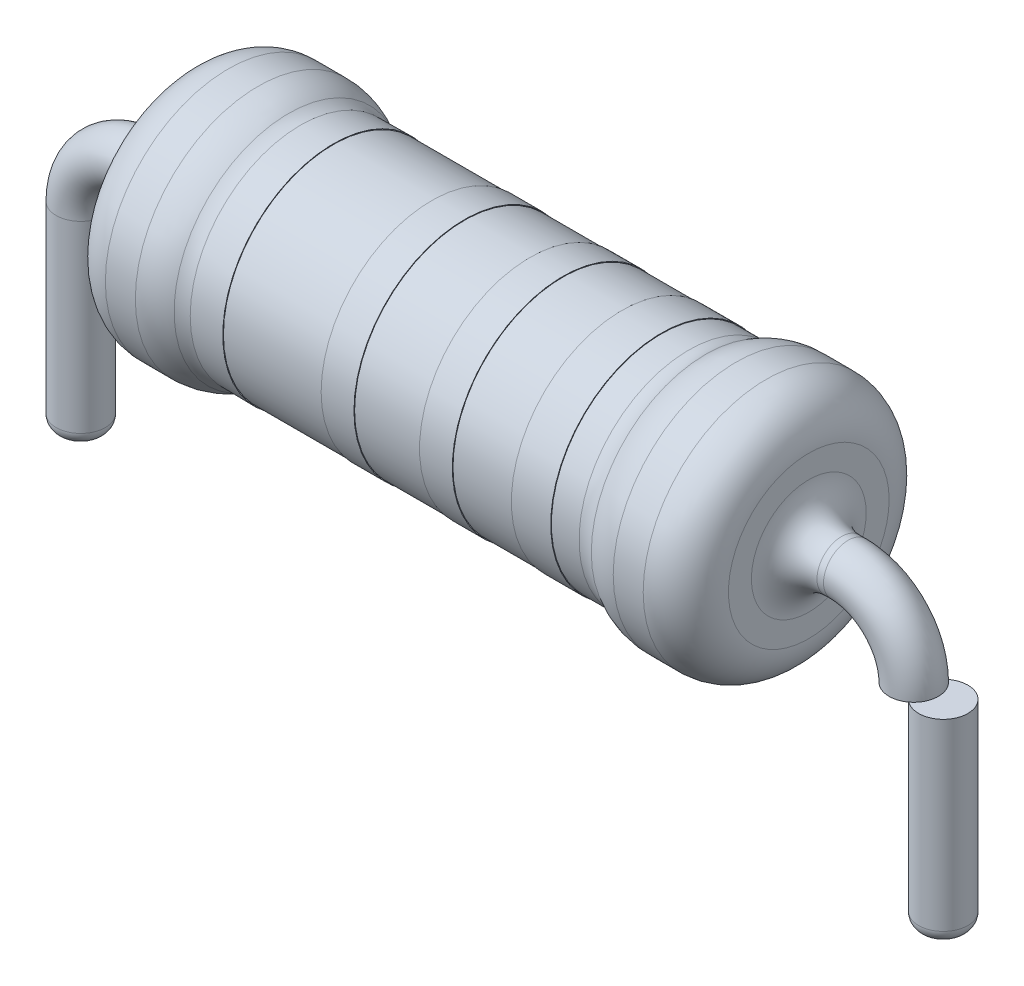
ISO-10303-21;
HEADER;
FILE_DESCRIPTION(('STEP AP214'),'2;1');
FILE_NAME('part.step','',(''),(''),'','','');
FILE_SCHEMA(('AUTOMOTIVE_DESIGN { 1 0 10303 214 1 1 1 1 }'));
ENDSEC;
DATA;
#1=APPLICATION_CONTEXT('core data for automotive mechanical design processes');
#2=APPLICATION_PROTOCOL_DEFINITION('international standard','automotive_design',2000,#1);
#3=PRODUCT_CONTEXT('',#1,'mechanical');
#4=PRODUCT('Part','Part','',(#3));
#5=PRODUCT_RELATED_PRODUCT_CATEGORY('part','',(#4));
#6=PRODUCT_DEFINITION_FORMATION('','',#4);
#7=PRODUCT_DEFINITION_CONTEXT('part definition',#1,'design');
#8=PRODUCT_DEFINITION('design','',#6,#7);
#9=PRODUCT_DEFINITION_SHAPE('','',#8);
#10=(LENGTH_UNIT() NAMED_UNIT(*) SI_UNIT(.MILLI.,.METRE.));
#11=(NAMED_UNIT(*) PLANE_ANGLE_UNIT() SI_UNIT($,.RADIAN.));
#12=(NAMED_UNIT(*) SI_UNIT($,.STERADIAN.) SOLID_ANGLE_UNIT());
#13=UNCERTAINTY_MEASURE_WITH_UNIT(LENGTH_MEASURE(1.E-05),#10,'distance_accuracy_value','');
#14=(GEOMETRIC_REPRESENTATION_CONTEXT(3) GLOBAL_UNCERTAINTY_ASSIGNED_CONTEXT((#13)) GLOBAL_UNIT_ASSIGNED_CONTEXT((#10,
#11,#12)) REPRESENTATION_CONTEXT('',''));
#15=CARTESIAN_POINT('',(0.,0.,0.));
#16=DIRECTION('',(0.,0.,1.));
#17=DIRECTION('',(1.,0.,0.));
#18=AXIS2_PLACEMENT_3D('',#15,#16,#17);
#19=CARTESIAN_POINT('',(2.5,7.5,0.));
#20=DIRECTION('',(1.,0.,0.));
#21=DIRECTION('',(0.,0.,-1.));
#22=AXIS2_PLACEMENT_3D('',#19,#20,#21);
#23=PLANE('',#22);
#24=CARTESIAN_POINT('',(2.5,7.5,0.));
#25=DIRECTION('',(1.,0.,0.));
#26=DIRECTION('',(0.,0.,-1.));
#27=AXIS2_PLACEMENT_3D('',#24,#25,#26);
#28=CIRCLE('',#27,1.675);
#29=CARTESIAN_POINT('',(2.5,7.5,-1.675));
#30=VERTEX_POINT('',#29);
#31=EDGE_CURVE('E135',#30,#30,#28,.T.);
#32=ORIENTED_EDGE('',*,*,#31,.F.);
#33=EDGE_LOOP('',(#32));
#34=FACE_BOUND('',#33,.T.);
#35=CARTESIAN_POINT('',(2.5,7.5,0.));
#36=DIRECTION('',(1.,0.,0.));
#37=DIRECTION('',(0.,0.,-1.));
#38=AXIS2_PLACEMENT_3D('',#35,#36,#37);
#39=CIRCLE('',#38,1.685);
#40=CARTESIAN_POINT('',(2.5,7.5,-1.685));
#41=VERTEX_POINT('',#40);
#42=EDGE_CURVE('E130',#41,#41,#39,.F.);
#43=ORIENTED_EDGE('',*,*,#42,.F.);
#44=EDGE_LOOP('',(#43));
#45=FACE_BOUND('',#44,.T.);
#46=ADVANCED_FACE('F47',(#34,#45),#23,.T.);
#47=CARTESIAN_POINT('',(1.9,7.5,0.));
#48=DIRECTION('',(1.,0.,0.));
#49=DIRECTION('',(0.,0.,-1.));
#50=AXIS2_PLACEMENT_3D('',#47,#48,#49);
#51=CYLINDRICAL_SURFACE('',#50,1.685);
#52=ORIENTED_EDGE('',*,*,#42,.T.);
#53=EDGE_LOOP('',(#52));
#54=FACE_BOUND('',#53,.T.);
#55=CARTESIAN_POINT('',(1.9,7.5,0.));
#56=DIRECTION('',(1.,0.,0.));
#57=DIRECTION('',(0.,0.,-1.));
#58=AXIS2_PLACEMENT_3D('',#55,#56,#57);
#59=CIRCLE('',#58,1.685);
#60=CARTESIAN_POINT('',(1.9,7.5,-1.685));
#61=VERTEX_POINT('',#60);
#62=EDGE_CURVE('E163',#61,#61,#59,.T.);
#63=ORIENTED_EDGE('',*,*,#62,.T.);
#64=EDGE_LOOP('',(#63));
#65=FACE_BOUND('',#64,.T.);
#66=ADVANCED_FACE('F230',(#54,#65),#51,.T.);
#67=CARTESIAN_POINT('',(1.9,7.5,0.));
#68=DIRECTION('',(1.,0.,0.));
#69=DIRECTION('',(0.,0.,-1.));
#70=AXIS2_PLACEMENT_3D('',#67,#68,#69);
#71=PLANE('',#70);
#72=ORIENTED_EDGE('',*,*,#62,.F.);
#73=EDGE_LOOP('',(#72));
#74=FACE_BOUND('',#73,.T.);
#75=CARTESIAN_POINT('',(1.9,7.5,0.));
#76=DIRECTION('',(-1.,0.,0.));
#77=DIRECTION('',(0.,0.,1.));
#78=AXIS2_PLACEMENT_3D('',#75,#76,#77);
#79=CIRCLE('',#78,1.675);
#80=CARTESIAN_POINT('',(1.9,7.5,1.675));
#81=VERTEX_POINT('',#80);
#82=EDGE_CURVE('E169',#81,#81,#79,.T.);
#83=ORIENTED_EDGE('',*,*,#82,.F.);
#84=EDGE_LOOP('',(#83));
#85=FACE_BOUND('',#84,.T.);
#86=ADVANCED_FACE('F226',(#74,#85),#71,.F.);
#87=CARTESIAN_POINT('',(-4.75,7.5,0.));
#88=DIRECTION('',(-1.,0.,0.));
#89=DIRECTION('',(0.,0.,1.));
#90=AXIS2_PLACEMENT_3D('',#87,#88,#89);
#91=CYLINDRICAL_SURFACE('',#90,1.675);
#92=ORIENTED_EDGE('',*,*,#82,.T.);
#93=EDGE_LOOP('',(#92));
#94=FACE_BOUND('',#93,.T.);
#95=CARTESIAN_POINT('',(1.,7.5,0.));
#96=DIRECTION('',(-1.,0.,0.));
#97=DIRECTION('',(0.,0.,1.));
#98=AXIS2_PLACEMENT_3D('',#95,#96,#97);
#99=CIRCLE('',#98,1.675);
#100=CARTESIAN_POINT('',(1.,7.5,1.675));
#101=VERTEX_POINT('',#100);
#102=EDGE_CURVE('E495',#101,#101,#99,.T.);
#103=ORIENTED_EDGE('',*,*,#102,.F.);
#104=EDGE_LOOP('',(#103));
#105=FACE_BOUND('',#104,.T.);
#106=ADVANCED_FACE('F222',(#94,#105),#91,.T.);
#107=CARTESIAN_POINT('',(1.,7.5,0.));
#108=DIRECTION('',(1.,0.,0.));
#109=DIRECTION('',(0.,0.,-1.));
#110=AXIS2_PLACEMENT_3D('',#107,#108,#109);
#111=PLANE('',#110);
#112=CARTESIAN_POINT('',(1.,7.5,0.));
#113=DIRECTION('',(1.,0.,0.));
#114=DIRECTION('',(0.,0.,-1.));
#115=AXIS2_PLACEMENT_3D('',#112,#113,#114);
#116=CIRCLE('',#115,1.685);
#117=CARTESIAN_POINT('',(1.,7.5,-1.685));
#118=VERTEX_POINT('',#117);
#119=EDGE_CURVE('E490',#118,#118,#116,.F.);
#120=ORIENTED_EDGE('',*,*,#119,.F.);
#121=EDGE_LOOP('',(#120));
#122=FACE_BOUND('',#121,.T.);
#123=ORIENTED_EDGE('',*,*,#102,.T.);
#124=EDGE_LOOP('',(#123));
#125=FACE_BOUND('',#124,.T.);
#126=ADVANCED_FACE('F218',(#122,#125),#111,.T.);
#127=CARTESIAN_POINT('',(0.5,7.5,0.));
#128=DIRECTION('',(1.,0.,0.));
#129=DIRECTION('',(0.,0.,-1.));
#130=AXIS2_PLACEMENT_3D('',#127,#128,#129);
#131=CYLINDRICAL_SURFACE('',#130,1.685);
#132=ORIENTED_EDGE('',*,*,#119,.T.);
#133=EDGE_LOOP('',(#132));
#134=FACE_BOUND('',#133,.T.);
#135=CARTESIAN_POINT('',(0.5,7.5,0.));
#136=DIRECTION('',(1.,0.,0.));
#137=DIRECTION('',(0.,0.,-1.));
#138=AXIS2_PLACEMENT_3D('',#135,#136,#137);
#139=CIRCLE('',#138,1.685);
#140=CARTESIAN_POINT('',(0.5,7.5,-1.685));
#141=VERTEX_POINT('',#140);
#142=EDGE_CURVE('E485',#141,#141,#139,.T.);
#143=ORIENTED_EDGE('',*,*,#142,.T.);
#144=EDGE_LOOP('',(#143));
#145=FACE_BOUND('',#144,.T.);
#146=ADVANCED_FACE('F214',(#134,#145),#131,.T.);
#147=CARTESIAN_POINT('',(0.5,7.5,0.));
#148=DIRECTION('',(1.,0.,0.));
#149=DIRECTION('',(0.,0.,-1.));
#150=AXIS2_PLACEMENT_3D('',#147,#148,#149);
#151=PLANE('',#150);
#152=ORIENTED_EDGE('',*,*,#142,.F.);
#153=EDGE_LOOP('',(#152));
#154=FACE_BOUND('',#153,.T.);
#155=CARTESIAN_POINT('',(0.5,7.5,0.));
#156=DIRECTION('',(-1.,0.,0.));
#157=DIRECTION('',(0.,0.,1.));
#158=AXIS2_PLACEMENT_3D('',#155,#156,#157);
#159=CIRCLE('',#158,1.675);
#160=CARTESIAN_POINT('',(0.5,7.5,1.675));
#161=VERTEX_POINT('',#160);
#162=EDGE_CURVE('E480',#161,#161,#159,.T.);
#163=ORIENTED_EDGE('',*,*,#162,.F.);
#164=EDGE_LOOP('',(#163));
#165=FACE_BOUND('',#164,.T.);
#166=ADVANCED_FACE('F210',(#154,#165),#151,.F.);
#167=CARTESIAN_POINT('',(-4.75,7.5,0.));
#168=DIRECTION('',(-1.,0.,0.));
#169=DIRECTION('',(0.,0.,1.));
#170=AXIS2_PLACEMENT_3D('',#167,#168,#169);
#171=CYLINDRICAL_SURFACE('',#170,1.675);
#172=ORIENTED_EDGE('',*,*,#162,.T.);
#173=EDGE_LOOP('',(#172));
#174=FACE_BOUND('',#173,.T.);
#175=CARTESIAN_POINT('',(-0.5,7.5,0.));
#176=DIRECTION('',(-1.,0.,0.));
#177=DIRECTION('',(0.,0.,1.));
#178=AXIS2_PLACEMENT_3D('',#175,#176,#177);
#179=CIRCLE('',#178,1.675);
#180=CARTESIAN_POINT('',(-0.5,7.5,1.675));
#181=VERTEX_POINT('',#180);
#182=EDGE_CURVE('E475',#181,#181,#179,.T.);
#183=ORIENTED_EDGE('',*,*,#182,.F.);
#184=EDGE_LOOP('',(#183));
#185=FACE_BOUND('',#184,.T.);
#186=ADVANCED_FACE('F206',(#174,#185),#171,.T.);
#187=CARTESIAN_POINT('',(-0.5,7.5,0.));
#188=DIRECTION('',(1.,0.,0.));
#189=DIRECTION('',(0.,0.,-1.));
#190=AXIS2_PLACEMENT_3D('',#187,#188,#189);
#191=PLANE('',#190);
#192=ORIENTED_EDGE('',*,*,#182,.T.);
#193=EDGE_LOOP('',(#192));
#194=FACE_BOUND('',#193,.T.);
#195=CARTESIAN_POINT('',(-0.5,7.5,0.));
#196=DIRECTION('',(-1.,0.,0.));
#197=DIRECTION('',(0.,0.,1.));
#198=AXIS2_PLACEMENT_3D('',#195,#196,#197);
#199=CIRCLE('',#198,1.685);
#200=CARTESIAN_POINT('',(-0.5,7.5,1.685));
#201=VERTEX_POINT('',#200);
#202=EDGE_CURVE('E471',#201,#201,#199,.T.);
#203=ORIENTED_EDGE('',*,*,#202,.F.);
#204=EDGE_LOOP('',(#203));
#205=FACE_BOUND('',#204,.T.);
#206=ADVANCED_FACE('F202',(#194,#205),#191,.T.);
#207=CARTESIAN_POINT('',(-0.5,7.5,0.));
#208=DIRECTION('',(-1.,0.,0.));
#209=DIRECTION('',(0.,0.,1.));
#210=AXIS2_PLACEMENT_3D('',#207,#208,#209);
#211=CYLINDRICAL_SURFACE('',#210,1.685);
#212=ORIENTED_EDGE('',*,*,#202,.T.);
#213=EDGE_LOOP('',(#212));
#214=FACE_BOUND('',#213,.T.);
#215=CARTESIAN_POINT('',(-1.,7.5,0.));
#216=DIRECTION('',(-1.,0.,0.));
#217=DIRECTION('',(0.,0.,1.));
#218=AXIS2_PLACEMENT_3D('',#215,#216,#217);
#219=CIRCLE('',#218,1.685);
#220=CARTESIAN_POINT('',(-1.,7.5,1.685));
#221=VERTEX_POINT('',#220);
#222=EDGE_CURVE('E467',#221,#221,#219,.F.);
#223=ORIENTED_EDGE('',*,*,#222,.T.);
#224=EDGE_LOOP('',(#223));
#225=FACE_BOUND('',#224,.T.);
#226=ADVANCED_FACE('F198',(#214,#225),#211,.T.);
#227=CARTESIAN_POINT('',(-3.,7.5,0.));
#228=DIRECTION('',(1.,0.,0.));
#229=DIRECTION('',(0.,0.,-1.));
#230=AXIS2_PLACEMENT_3D('',#227,#228,#229);
#231=CYLINDRICAL_SURFACE('',#230,1.685);
#232=CARTESIAN_POINT('',(-3.,7.5,0.));
#233=DIRECTION('',(-1.,0.,0.));
#234=DIRECTION('',(0.,0.,1.));
#235=AXIS2_PLACEMENT_3D('',#232,#233,#234);
#236=CIRCLE('',#235,1.68103627422793);
#237=CARTESIAN_POINT('',(-3.,7.5,1.68103627422793));
#238=VERTEX_POINT('',#237);
#239=EDGE_CURVE('E78',#238,#238,#236,.T.);
#240=ORIENTED_EDGE('',*,*,#239,.F.);
#241=EDGE_LOOP('',(#240));
#242=FACE_BOUND('',#241,.T.);
#243=CARTESIAN_POINT('',(-2.5,7.5,0.));
#244=DIRECTION('',(1.,0.,0.));
#245=DIRECTION('',(0.,0.,-1.));
#246=AXIS2_PLACEMENT_3D('',#243,#244,#245);
#247=CIRCLE('',#246,1.685);
#248=CARTESIAN_POINT('',(-2.5,7.5,-1.685));
#249=VERTEX_POINT('',#248);
#250=EDGE_CURVE('E141',#249,#249,#247,.T.);
#251=ORIENTED_EDGE('',*,*,#250,.F.);
#252=EDGE_LOOP('',(#251));
#253=FACE_BOUND('',#252,.T.);
#254=ADVANCED_FACE('F187',(#242,#253),#231,.T.);
#255=CARTESIAN_POINT('',(-1.,7.5,0.));
#256=DIRECTION('',(1.,0.,0.));
#257=DIRECTION('',(0.,0.,-1.));
#258=AXIS2_PLACEMENT_3D('',#255,#256,#257);
#259=PLANE('',#258);
#260=CARTESIAN_POINT('',(-1.,7.5,0.));
#261=DIRECTION('',(-1.,0.,0.));
#262=DIRECTION('',(0.,0.,1.));
#263=AXIS2_PLACEMENT_3D('',#260,#261,#262);
#264=CIRCLE('',#263,1.675);
#265=CARTESIAN_POINT('',(-1.,7.5,1.675));
#266=VERTEX_POINT('',#265);
#267=EDGE_CURVE('E136',#266,#266,#264,.T.);
#268=ORIENTED_EDGE('',*,*,#267,.F.);
#269=EDGE_LOOP('',(#268));
#270=FACE_BOUND('',#269,.T.);
#271=ORIENTED_EDGE('',*,*,#222,.F.);
#272=EDGE_LOOP('',(#271));
#273=FACE_BOUND('',#272,.T.);
#274=ADVANCED_FACE('F197',(#270,#273),#259,.F.);
#275=CARTESIAN_POINT('',(-2.5,7.5,0.));
#276=DIRECTION('',(1.,0.,0.));
#277=DIRECTION('',(0.,0.,-1.));
#278=AXIS2_PLACEMENT_3D('',#275,#276,#277);
#279=PLANE('',#278);
#280=ORIENTED_EDGE('',*,*,#250,.T.);
#281=EDGE_LOOP('',(#280));
#282=FACE_BOUND('',#281,.T.);
#283=CARTESIAN_POINT('',(-2.5,7.5,0.));
#284=DIRECTION('',(-1.,0.,0.));
#285=DIRECTION('',(0.,0.,1.));
#286=AXIS2_PLACEMENT_3D('',#283,#284,#285);
#287=CIRCLE('',#286,1.675);
#288=CARTESIAN_POINT('',(-2.5,7.5,1.675));
#289=VERTEX_POINT('',#288);
#290=EDGE_CURVE('E131',#289,#289,#287,.F.);
#291=ORIENTED_EDGE('',*,*,#290,.F.);
#292=EDGE_LOOP('',(#291));
#293=FACE_BOUND('',#292,.T.);
#294=ADVANCED_FACE('F270',(#282,#293),#279,.T.);
#295=CARTESIAN_POINT('',(-4.75,7.5,0.));
#296=DIRECTION('',(-1.,0.,0.));
#297=DIRECTION('',(0.,0.,1.));
#298=AXIS2_PLACEMENT_3D('',#295,#296,#297);
#299=CYLINDRICAL_SURFACE('',#298,1.675);
#300=ORIENTED_EDGE('',*,*,#290,.T.);
#301=EDGE_LOOP('',(#300));
#302=FACE_BOUND('',#301,.T.);
#303=ORIENTED_EDGE('',*,*,#267,.T.);
#304=EDGE_LOOP('',(#303));
#305=FACE_BOUND('',#304,.T.);
#306=ADVANCED_FACE('F268',(#302,#305),#299,.T.);
#307=CARTESIAN_POINT('',(-4.75,7.5,0.));
#308=DIRECTION('',(-1.,0.,0.));
#309=DIRECTION('',(0.,0.,1.));
#310=AXIS2_PLACEMENT_3D('',#307,#308,#309);
#311=CYLINDRICAL_SURFACE('',#310,1.675);
#312=CARTESIAN_POINT('',(2.92254138123248,7.5,0.));
#313=DIRECTION('',(1.,0.,0.));
#314=DIRECTION('',(0.,0.,-1.));
#315=AXIS2_PLACEMENT_3D('',#312,#313,#314);
#316=CIRCLE('',#315,1.675);
#317=CARTESIAN_POINT('',(2.92254138123248,7.5,-1.675));
#318=VERTEX_POINT('',#317);
#319=EDGE_CURVE('E707',#318,#318,#316,.F.);
#320=ORIENTED_EDGE('',*,*,#319,.T.);
#321=EDGE_LOOP('',(#320));
#322=FACE_BOUND('',#321,.T.);
#323=ORIENTED_EDGE('',*,*,#31,.T.);
#324=EDGE_LOOP('',(#323));
#325=FACE_BOUND('',#324,.T.);
#326=ADVANCED_FACE('F238',(#322,#325),#311,.T.);
#327=CARTESIAN_POINT('',(3.64302352755487,7.5,0.));
#328=DIRECTION('',(-1.,0.,0.));
#329=DIRECTION('',(0.,0.,1.));
#330=AXIS2_PLACEMENT_3D('',#327,#328,#329);
#331=TOROIDAL_SURFACE('',#330,0.977263692076684,0.897736307923315);
#332=CARTESIAN_POINT('',(3.18027316591827,7.5,0.));
#333=DIRECTION('',(1.,0.,0.));
#334=DIRECTION('',(0.,0.,-1.));
#335=AXIS2_PLACEMENT_3D('',#332,#333,#334);
#336=CIRCLE('',#335,1.74654425297041);
#337=CARTESIAN_POINT('',(3.18027316591827,7.5,-1.74654425297041));
#338=VERTEX_POINT('',#337);
#339=EDGE_CURVE('E698',#338,#338,#336,.T.);
#340=ORIENTED_EDGE('',*,*,#339,.T.);
#341=EDGE_LOOP('',(#340));
#342=FACE_BOUND('',#341,.T.);
#343=CARTESIAN_POINT('',(3.64302352755487,7.5,0.));
#344=DIRECTION('',(-1.,0.,0.));
#345=DIRECTION('',(0.,0.,1.));
#346=AXIS2_PLACEMENT_3D('',#343,#344,#345);
#347=CIRCLE('',#346,1.875);
#348=CARTESIAN_POINT('',(3.64302352755487,7.5,1.875));
#349=VERTEX_POINT('',#348);
#350=EDGE_CURVE('E126',#349,#349,#347,.F.);
#351=ORIENTED_EDGE('',*,*,#350,.F.);
#352=EDGE_LOOP('',(#351));
#353=FACE_BOUND('',#352,.T.);
#354=ADVANCED_FACE('F278',(#342,#353),#331,.T.);
#355=CARTESIAN_POINT('',(-4.75,7.5,0.));
#356=DIRECTION('',(-1.,0.,0.));
#357=DIRECTION('',(0.,0.,1.));
#358=AXIS2_PLACEMENT_3D('',#355,#356,#357);
#359=CYLINDRICAL_SURFACE('',#358,1.875);
#360=CARTESIAN_POINT('',(4.1,7.5,0.));
#361=DIRECTION('',(1.,0.,0.));
#362=DIRECTION('',(0.,0.,-1.));
#363=AXIS2_PLACEMENT_3D('',#360,#361,#362);
#364=CIRCLE('',#363,1.875);
#365=CARTESIAN_POINT('',(4.1,7.5,-1.875));
#366=VERTEX_POINT('',#365);
#367=EDGE_CURVE('E55',#366,#366,#364,.F.);
#368=ORIENTED_EDGE('',*,*,#367,.T.);
#369=EDGE_LOOP('',(#368));
#370=FACE_BOUND('',#369,.T.);
#371=ORIENTED_EDGE('',*,*,#350,.T.);
#372=EDGE_LOOP('',(#371));
#373=FACE_BOUND('',#372,.T.);
#374=ADVANCED_FACE('F286',(#370,#373),#359,.T.);
#375=CARTESIAN_POINT('',(4.75,0.,0.));
#376=DIRECTION('',(1.,0.,0.));
#377=DIRECTION('',(0.,0.,-1.));
#378=AXIS2_PLACEMENT_3D('',#375,#376,#377);
#379=PLANE('',#378);
#380=CARTESIAN_POINT('',(4.75,7.5,0.));
#381=DIRECTION('',(1.,0.,0.));
#382=DIRECTION('',(0.,0.,-1.));
#383=AXIS2_PLACEMENT_3D('',#380,#381,#382);
#384=CIRCLE('',#383,1.225);
#385=CARTESIAN_POINT('',(4.75,7.5,-1.225));
#386=VERTEX_POINT('',#385);
#387=EDGE_CURVE('E13',#386,#386,#384,.T.);
#388=ORIENTED_EDGE('',*,*,#387,.T.);
#389=EDGE_LOOP('',(#388));
#390=FACE_BOUND('',#389,.T.);
#391=CARTESIAN_POINT('',(4.75,7.5,0.));
#392=DIRECTION('',(1.,0.,0.));
#393=DIRECTION('',(0.,0.,-1.));
#394=AXIS2_PLACEMENT_3D('',#391,#392,#393);
#395=CIRCLE('',#394,0.875);
#396=CARTESIAN_POINT('',(4.75,7.5,-0.875));
#397=VERTEX_POINT('',#396);
#398=EDGE_CURVE('E695',#397,#397,#395,.F.);
#399=ORIENTED_EDGE('',*,*,#398,.T.);
#400=EDGE_LOOP('',(#399));
#401=FACE_BOUND('',#400,.T.);
#402=ADVANCED_FACE('F290',(#390,#401),#379,.T.);
#403=CARTESIAN_POINT('',(5.35,7.5,0.));
#404=DIRECTION('',(-1.,0.,0.));
#405=DIRECTION('',(0.,0.,1.));
#406=AXIS2_PLACEMENT_3D('',#403,#404,#405);
#407=CYLINDRICAL_SURFACE('',#406,0.375);
#408=CARTESIAN_POINT('',(5.25,7.5,0.));
#409=DIRECTION('',(1.,0.,0.));
#410=DIRECTION('',(0.,0.,-1.));
#411=AXIS2_PLACEMENT_3D('',#408,#409,#410);
#412=CIRCLE('',#411,0.375);
#413=CARTESIAN_POINT('',(5.25,7.5,-0.375));
#414=VERTEX_POINT('',#413);
#415=EDGE_CURVE('E701',#414,#414,#412,.T.);
#416=ORIENTED_EDGE('',*,*,#415,.T.);
#417=EDGE_LOOP('',(#416));
#418=FACE_BOUND('',#417,.T.);
#419=CARTESIAN_POINT('',(5.35,7.50000000000001,0.));
#420=DIRECTION('',(-1.,0.,0.));
#421=DIRECTION('',(0.,0.,1.));
#422=AXIS2_PLACEMENT_3D('',#419,#420,#421);
#423=CIRCLE('',#422,0.375);
#424=CARTESIAN_POINT('',(5.35,7.50000000000001,0.375));
#425=VERTEX_POINT('',#424);
#426=EDGE_CURVE('E74',#425,#425,#423,.F.);
#427=ORIENTED_EDGE('',*,*,#426,.F.);
#428=EDGE_LOOP('',(#427));
#429=FACE_BOUND('',#428,.T.);
#430=ADVANCED_FACE('F294',(#418,#429),#407,.T.);
#431=CARTESIAN_POINT('',(5.35,6.5,0.));
#432=DIRECTION('',(0.,0.,1.));
#433=DIRECTION('',(1.,0.,0.));
#434=AXIS2_PLACEMENT_3D('',#431,#432,#433);
#435=TOROIDAL_SURFACE('',#434,1.,0.375);
#436=CARTESIAN_POINT('',(6.35,6.5,0.));
#437=DIRECTION('',(0.,1.,0.));
#438=DIRECTION('',(0.,0.,1.));
#439=AXIS2_PLACEMENT_3D('',#436,#437,#438);
#440=CIRCLE('',#439,0.375);
#441=CARTESIAN_POINT('',(6.575,6.5,-0.299999999999999));
#442=VERTEX_POINT('',#441);
#443=CARTESIAN_POINT('',(6.575,6.5,0.300000000000002));
#444=VERTEX_POINT('',#443);
#445=EDGE_CURVE('E66',#442,#444,#440,.F.);
#446=ORIENTED_EDGE('',*,*,#445,.F.);
#447=EDGE_CURVE('E69',#444,#442,#440,.F.);
#448=ORIENTED_EDGE('',*,*,#447,.F.);
#449=EDGE_LOOP('',(#446,#448));
#450=FACE_BOUND('',#449,.T.);
#451=ORIENTED_EDGE('',*,*,#426,.T.);
#452=EDGE_LOOP('',(#451));
#453=FACE_BOUND('',#452,.T.);
#454=ADVANCED_FACE('F67',(#450,#453),#435,.T.);
#455=CARTESIAN_POINT('',(6.35,6.5,0.375));
#456=DIRECTION('',(0.,1.,0.));
#457=DIRECTION('',(0.,0.,1.));
#458=AXIS2_PLACEMENT_3D('',#455,#456,#457);
#459=PLANE('',#458);
#460=CARTESIAN_POINT('',(6.8,6.5,0.));
#461=DIRECTION('',(0.,-1.,0.));
#462=DIRECTION('',(0.,0.,-1.));
#463=AXIS2_PLACEMENT_3D('',#460,#461,#462);
#464=CIRCLE('',#463,0.375);
#465=EDGE_CURVE('E61',#444,#442,#464,.T.);
#466=ORIENTED_EDGE('',*,*,#465,.F.);
#467=ORIENTED_EDGE('',*,*,#447,.T.);
#468=EDGE_LOOP('',(#466,#467));
#469=FACE_BOUND('',#468,.T.);
#470=ADVANCED_FACE('F76',(#469),#459,.F.);
#471=CARTESIAN_POINT('',(-2.92254138123248,7.5,0.));
#472=DIRECTION('',(-1.,0.,0.));
#473=DIRECTION('',(0.,0.,1.));
#474=AXIS2_PLACEMENT_3D('',#471,#472,#473);
#475=TOROIDAL_SURFACE('',#474,2.175,0.5);
#476=ORIENTED_EDGE('',*,*,#239,.T.);
#477=EDGE_LOOP('',(#476));
#478=FACE_BOUND('',#477,.T.);
#479=CARTESIAN_POINT('',(-3.18027316591826,7.5,0.));
#480=DIRECTION('',(1.,0.,0.));
#481=DIRECTION('',(0.,0.,-1.));
#482=AXIS2_PLACEMENT_3D('',#479,#480,#481);
#483=CIRCLE('',#482,1.74654425297041);
#484=CARTESIAN_POINT('',(-3.18027316591826,7.5,-1.74654425297041));
#485=VERTEX_POINT('',#484);
#486=EDGE_CURVE('E97',#485,#485,#483,.F.);
#487=ORIENTED_EDGE('',*,*,#486,.F.);
#488=EDGE_LOOP('',(#487));
#489=FACE_BOUND('',#488,.T.);
#490=ADVANCED_FACE('F106',(#478,#489),#475,.F.);
#491=CARTESIAN_POINT('',(-3.64302352755487,7.5,0.));
#492=DIRECTION('',(-1.,0.,0.));
#493=DIRECTION('',(0.,0.,1.));
#494=AXIS2_PLACEMENT_3D('',#491,#492,#493);
#495=TOROIDAL_SURFACE('',#494,0.977263692076682,0.897736307923316);
#496=ORIENTED_EDGE('',*,*,#486,.T.);
#497=EDGE_LOOP('',(#496));
#498=FACE_BOUND('',#497,.T.);
#499=CARTESIAN_POINT('',(-3.64302352755487,7.5,0.));
#500=DIRECTION('',(1.,0.,0.));
#501=DIRECTION('',(0.,0.,-1.));
#502=AXIS2_PLACEMENT_3D('',#499,#500,#501);
#503=CIRCLE('',#502,1.875);
#504=CARTESIAN_POINT('',(-3.64302352755487,7.5,-1.875));
#505=VERTEX_POINT('',#504);
#506=EDGE_CURVE('E93',#505,#505,#503,.F.);
#507=ORIENTED_EDGE('',*,*,#506,.F.);
#508=EDGE_LOOP('',(#507));
#509=FACE_BOUND('',#508,.T.);
#510=ADVANCED_FACE('F111',(#498,#509),#495,.T.);
#511=CARTESIAN_POINT('',(-4.75,7.5,0.));
#512=DIRECTION('',(-1.,0.,0.));
#513=DIRECTION('',(0.,0.,1.));
#514=AXIS2_PLACEMENT_3D('',#511,#512,#513);
#515=CYLINDRICAL_SURFACE('',#514,1.875);
#516=CARTESIAN_POINT('',(-4.1,7.5,0.));
#517=DIRECTION('',(-1.,0.,0.));
#518=DIRECTION('',(0.,0.,1.));
#519=AXIS2_PLACEMENT_3D('',#516,#517,#518);
#520=CIRCLE('',#519,1.875);
#521=CARTESIAN_POINT('',(-4.1,7.5,1.875));
#522=VERTEX_POINT('',#521);
#523=EDGE_CURVE('E710',#522,#522,#520,.F.);
#524=ORIENTED_EDGE('',*,*,#523,.T.);
#525=EDGE_LOOP('',(#524));
#526=FACE_BOUND('',#525,.T.);
#527=ORIENTED_EDGE('',*,*,#506,.T.);
#528=EDGE_LOOP('',(#527));
#529=FACE_BOUND('',#528,.T.);
#530=ADVANCED_FACE('F316',(#526,#529),#515,.T.);
#531=CARTESIAN_POINT('',(-4.75,0.,0.));
#532=DIRECTION('',(-1.,0.,0.));
#533=DIRECTION('',(0.,0.,1.));
#534=AXIS2_PLACEMENT_3D('',#531,#532,#533);
#535=PLANE('',#534);
#536=CARTESIAN_POINT('',(-4.75,7.5,0.));
#537=DIRECTION('',(-1.,0.,0.));
#538=DIRECTION('',(0.,0.,1.));
#539=AXIS2_PLACEMENT_3D('',#536,#537,#538);
#540=CIRCLE('',#539,1.225);
#541=CARTESIAN_POINT('',(-4.75,7.5,1.225));
#542=VERTEX_POINT('',#541);
#543=EDGE_CURVE('E713',#542,#542,#540,.T.);
#544=ORIENTED_EDGE('',*,*,#543,.T.);
#545=EDGE_LOOP('',(#544));
#546=FACE_BOUND('',#545,.T.);
#547=CARTESIAN_POINT('',(-4.75,7.5,0.));
#548=DIRECTION('',(-1.,0.,0.));
#549=DIRECTION('',(0.,0.,1.));
#550=AXIS2_PLACEMENT_3D('',#547,#548,#549);
#551=CIRCLE('',#550,0.875);
#552=CARTESIAN_POINT('',(-4.75,7.5,0.875));
#553=VERTEX_POINT('',#552);
#554=EDGE_CURVE('E694',#553,#553,#551,.F.);
#555=ORIENTED_EDGE('',*,*,#554,.T.);
#556=EDGE_LOOP('',(#555));
#557=FACE_BOUND('',#556,.T.);
#558=ADVANCED_FACE('F311',(#546,#557),#535,.T.);
#559=CARTESIAN_POINT('',(-5.35,7.5,0.));
#560=DIRECTION('',(1.,0.,0.));
#561=DIRECTION('',(0.,0.,-1.));
#562=AXIS2_PLACEMENT_3D('',#559,#560,#561);
#563=CYLINDRICAL_SURFACE('',#562,0.375);
#564=CARTESIAN_POINT('',(-5.25,7.5,0.));
#565=DIRECTION('',(-1.,0.,0.));
#566=DIRECTION('',(0.,0.,1.));
#567=AXIS2_PLACEMENT_3D('',#564,#565,#566);
#568=CIRCLE('',#567,0.375);
#569=CARTESIAN_POINT('',(-5.25,7.5,0.375));
#570=VERTEX_POINT('',#569);
#571=EDGE_CURVE('E690',#570,#570,#568,.T.);
#572=ORIENTED_EDGE('',*,*,#571,.T.);
#573=EDGE_LOOP('',(#572));
#574=FACE_BOUND('',#573,.T.);
#575=CARTESIAN_POINT('',(-5.35,7.50000000000001,0.));
#576=DIRECTION('',(1.,0.,0.));
#577=DIRECTION('',(0.,0.,-1.));
#578=AXIS2_PLACEMENT_3D('',#575,#576,#577);
#579=CIRCLE('',#578,0.375);
#580=CARTESIAN_POINT('',(-5.35,7.87500000000001,0.));
#581=VERTEX_POINT('',#580);
#582=EDGE_CURVE('E87',#581,#581,#579,.F.);
#583=ORIENTED_EDGE('',*,*,#582,.F.);
#584=EDGE_LOOP('',(#583));
#585=FACE_BOUND('',#584,.T.);
#586=ADVANCED_FACE('F315',(#574,#585),#563,.T.);
#587=CARTESIAN_POINT('',(-5.35,6.5,0.));
#588=DIRECTION('',(0.,0.,-1.));
#589=DIRECTION('',(-1.,0.,0.));
#590=AXIS2_PLACEMENT_3D('',#587,#588,#589);
#591=TOROIDAL_SURFACE('',#590,1.,0.375);
#592=CARTESIAN_POINT('',(-6.35,6.5,0.));
#593=DIRECTION('',(0.,1.,0.));
#594=DIRECTION('',(0.,0.,1.));
#595=AXIS2_PLACEMENT_3D('',#592,#593,#594);
#596=CIRCLE('',#595,0.375);
#597=CARTESIAN_POINT('',(-6.725,6.5,0.));
#598=VERTEX_POINT('',#597);
#599=EDGE_CURVE('E84',#598,#598,#596,.F.);
#600=CARTESIAN_POINT('',(-5.35,6.5,0.));
#601=DIRECTION('',(0.,0.,-1.));
#602=DIRECTION('',(-1.,0.,0.));
#603=AXIS2_PLACEMENT_3D('',#600,#601,#602);
#604=CIRCLE('',#603,1.375);
#605=EDGE_CURVE('',#598,#581,#604,.T.);
#606=ORIENTED_EDGE('',*,*,#599,.F.);
#607=ORIENTED_EDGE('',*,*,#582,.T.);
#608=ORIENTED_EDGE('',*,*,#605,.T.);
#609=ORIENTED_EDGE('',*,*,#605,.F.);
#610=EDGE_LOOP('',(#606,#608,#607,#609));
#611=FACE_BOUND('',#610,.T.);
#612=ADVANCED_FACE('F324',(#611),#591,.T.);
#613=CARTESIAN_POINT('',(6.8,6.5,0.));
#614=DIRECTION('',(0.,-1.,0.));
#615=DIRECTION('',(0.,0.,-1.));
#616=AXIS2_PLACEMENT_3D('',#613,#614,#615);
#617=PLANE('',#616);
#618=EDGE_CURVE('E79',#442,#444,#464,.T.);
#619=ORIENTED_EDGE('',*,*,#618,.F.);
#620=ORIENTED_EDGE('',*,*,#445,.T.);
#621=EDGE_LOOP('',(#619,#620));
#622=FACE_BOUND('',#621,.T.);
#623=ADVANCED_FACE('F80',(#622),#617,.F.);
#624=CARTESIAN_POINT('',(6.8,3.5,0.));
#625=DIRECTION('',(0.,1.,0.));
#626=DIRECTION('',(0.,0.,1.));
#627=AXIS2_PLACEMENT_3D('',#624,#625,#626);
#628=CYLINDRICAL_SURFACE('',#627,0.375);
#629=CARTESIAN_POINT('',(6.8,3.7,0.));
#630=DIRECTION('',(0.,-1.,0.));
#631=DIRECTION('',(0.,0.,-1.));
#632=AXIS2_PLACEMENT_3D('',#629,#630,#631);
#633=CIRCLE('',#632,0.375);
#634=CARTESIAN_POINT('',(6.8,3.7,-0.375000000000005));
#635=VERTEX_POINT('',#634);
#636=EDGE_CURVE('E743',#635,#635,#633,.F.);
#637=ORIENTED_EDGE('',*,*,#636,.T.);
#638=EDGE_LOOP('',(#637));
#639=FACE_BOUND('',#638,.T.);
#640=ORIENTED_EDGE('',*,*,#465,.T.);
#641=ORIENTED_EDGE('',*,*,#618,.T.);
#642=EDGE_LOOP('',(#640,#641));
#643=FACE_BOUND('',#642,.T.);
#644=ADVANCED_FACE('F83',(#639,#643),#628,.T.);
#645=CARTESIAN_POINT('',(6.8,3.5,0.));
#646=DIRECTION('',(0.,-1.,0.));
#647=DIRECTION('',(0.,0.,-1.));
#648=AXIS2_PLACEMENT_3D('',#645,#646,#647);
#649=PLANE('',#648);
#650=CARTESIAN_POINT('',(6.8,3.5,0.));
#651=DIRECTION('',(0.,-1.,0.));
#652=DIRECTION('',(0.,0.,-1.));
#653=AXIS2_PLACEMENT_3D('',#650,#651,#652);
#654=CIRCLE('',#653,0.175);
#655=CARTESIAN_POINT('',(6.8,3.5,-0.175000000000006));
#656=VERTEX_POINT('',#655);
#657=EDGE_CURVE('E746',#656,#656,#654,.T.);
#658=ORIENTED_EDGE('',*,*,#657,.T.);
#659=EDGE_LOOP('',(#658));
#660=FACE_BOUND('',#659,.T.);
#661=ADVANCED_FACE('F331',(#660),#649,.T.);
#662=CARTESIAN_POINT('',(-6.35,3.5,0.));
#663=DIRECTION('',(0.,1.,0.));
#664=DIRECTION('',(0.,0.,1.));
#665=AXIS2_PLACEMENT_3D('',#662,#663,#664);
#666=CYLINDRICAL_SURFACE('',#665,0.375);
#667=CARTESIAN_POINT('',(-6.35,3.7,0.));
#668=DIRECTION('',(0.,-1.,0.));
#669=DIRECTION('',(0.,0.,-1.));
#670=AXIS2_PLACEMENT_3D('',#667,#668,#669);
#671=CIRCLE('',#670,0.375);
#672=CARTESIAN_POINT('',(-6.35,3.7,-0.374999999999994));
#673=VERTEX_POINT('',#672);
#674=EDGE_CURVE('E748',#673,#673,#671,.F.);
#675=ORIENTED_EDGE('',*,*,#674,.T.);
#676=EDGE_LOOP('',(#675));
#677=FACE_BOUND('',#676,.T.);
#678=ORIENTED_EDGE('',*,*,#599,.T.);
#679=EDGE_LOOP('',(#678));
#680=FACE_BOUND('',#679,.T.);
#681=ADVANCED_FACE('F339',(#677,#680),#666,.T.);
#682=CARTESIAN_POINT('',(-6.35,3.5,0.));
#683=DIRECTION('',(0.,-1.,0.));
#684=DIRECTION('',(0.,0.,-1.));
#685=AXIS2_PLACEMENT_3D('',#682,#683,#684);
#686=PLANE('',#685);
#687=CARTESIAN_POINT('',(-6.35,3.5,0.));
#688=DIRECTION('',(0.,-1.,0.));
#689=DIRECTION('',(0.,0.,-1.));
#690=AXIS2_PLACEMENT_3D('',#687,#688,#689);
#691=CIRCLE('',#690,0.175);
#692=CARTESIAN_POINT('',(-6.35,3.5,-0.174999999999993));
#693=VERTEX_POINT('',#692);
#694=EDGE_CURVE('E178',#693,#693,#691,.T.);
#695=ORIENTED_EDGE('',*,*,#694,.T.);
#696=EDGE_LOOP('',(#695));
#697=FACE_BOUND('',#696,.T.);
#698=ADVANCED_FACE('F243',(#697),#686,.T.);
#699=CARTESIAN_POINT('',(-6.35,3.7,0.));
#700=DIRECTION('',(0.,-1.,0.));
#701=DIRECTION('',(0.,0.,-1.));
#702=AXIS2_PLACEMENT_3D('',#699,#700,#701);
#703=DEGENERATE_TOROIDAL_SURFACE('',#702,0.175,0.2,.T.);
#704=ORIENTED_EDGE('',*,*,#674,.F.);
#705=EDGE_LOOP('',(#704));
#706=FACE_BOUND('',#705,.T.);
#707=ORIENTED_EDGE('',*,*,#694,.F.);
#708=EDGE_LOOP('',(#707));
#709=FACE_BOUND('',#708,.T.);
#710=ADVANCED_FACE('F239',(#706,#709),#703,.T.);
#711=CARTESIAN_POINT('',(6.8,3.7,0.));
#712=DIRECTION('',(0.,-1.,0.));
#713=DIRECTION('',(0.,0.,-1.));
#714=AXIS2_PLACEMENT_3D('',#711,#712,#713);
#715=DEGENERATE_TOROIDAL_SURFACE('',#714,0.175,0.2,.T.);
#716=ORIENTED_EDGE('',*,*,#636,.F.);
#717=EDGE_LOOP('',(#716));
#718=FACE_BOUND('',#717,.T.);
#719=ORIENTED_EDGE('',*,*,#657,.F.);
#720=EDGE_LOOP('',(#719));
#721=FACE_BOUND('',#720,.T.);
#722=ADVANCED_FACE('F242',(#718,#721),#715,.T.);
#723=CARTESIAN_POINT('',(5.25,7.5,0.));
#724=DIRECTION('',(1.,0.,0.));
#725=DIRECTION('',(0.,0.,-1.));
#726=AXIS2_PLACEMENT_3D('',#723,#724,#725);
#727=TOROIDAL_SURFACE('',#726,0.875,0.5);
#728=ORIENTED_EDGE('',*,*,#398,.F.);
#729=EDGE_LOOP('',(#728));
#730=FACE_BOUND('',#729,.T.);
#731=ORIENTED_EDGE('',*,*,#415,.F.);
#732=EDGE_LOOP('',(#731));
#733=FACE_BOUND('',#732,.T.);
#734=ADVANCED_FACE('F247',(#730,#733),#727,.F.);
#735=CARTESIAN_POINT('',(-5.25,7.5,0.));
#736=DIRECTION('',(-1.,0.,0.));
#737=DIRECTION('',(0.,0.,1.));
#738=AXIS2_PLACEMENT_3D('',#735,#736,#737);
#739=TOROIDAL_SURFACE('',#738,0.875,0.5);
#740=ORIENTED_EDGE('',*,*,#554,.F.);
#741=EDGE_LOOP('',(#740));
#742=FACE_BOUND('',#741,.T.);
#743=ORIENTED_EDGE('',*,*,#571,.F.);
#744=EDGE_LOOP('',(#743));
#745=FACE_BOUND('',#744,.T.);
#746=ADVANCED_FACE('F251',(#742,#745),#739,.F.);
#747=CARTESIAN_POINT('',(2.92254138123248,7.5,0.));
#748=DIRECTION('',(1.,0.,0.));
#749=DIRECTION('',(0.,0.,-1.));
#750=AXIS2_PLACEMENT_3D('',#747,#748,#749);
#751=TOROIDAL_SURFACE('',#750,2.175,0.5);
#752=ORIENTED_EDGE('',*,*,#319,.F.);
#753=EDGE_LOOP('',(#752));
#754=FACE_BOUND('',#753,.T.);
#755=ORIENTED_EDGE('',*,*,#339,.F.);
#756=EDGE_LOOP('',(#755));
#757=FACE_BOUND('',#756,.T.);
#758=ADVANCED_FACE('F255',(#754,#757),#751,.F.);
#759=CARTESIAN_POINT('',(-4.1,7.5,0.));
#760=DIRECTION('',(-1.,0.,0.));
#761=DIRECTION('',(0.,0.,1.));
#762=AXIS2_PLACEMENT_3D('',#759,#760,#761);
#763=TOROIDAL_SURFACE('',#762,1.225,0.65);
#764=ORIENTED_EDGE('',*,*,#543,.F.);
#765=EDGE_LOOP('',(#764));
#766=FACE_BOUND('',#765,.T.);
#767=ORIENTED_EDGE('',*,*,#523,.F.);
#768=EDGE_LOOP('',(#767));
#769=FACE_BOUND('',#768,.T.);
#770=ADVANCED_FACE('F258',(#766,#769),#763,.T.);
#771=CARTESIAN_POINT('',(4.1,7.5,0.));
#772=DIRECTION('',(1.,0.,0.));
#773=DIRECTION('',(0.,0.,-1.));
#774=AXIS2_PLACEMENT_3D('',#771,#772,#773);
#775=TOROIDAL_SURFACE('',#774,1.225,0.65);
#776=ORIENTED_EDGE('',*,*,#387,.F.);
#777=EDGE_LOOP('',(#776));
#778=FACE_BOUND('',#777,.T.);
#779=ORIENTED_EDGE('',*,*,#367,.F.);
#780=EDGE_LOOP('',(#779));
#781=FACE_BOUND('',#780,.T.);
#782=ADVANCED_FACE('F49',(#778,#781),#775,.T.);
#783=CLOSED_SHELL('',(#46,#66,#86,#106,#126,#146,#166,#186,#206,#226,#254,#274,#294,#306,#326,
#354,#374,#402,#430,#454,#470,#490,#510,#530,#558,#586,#612,#623,#644,#661,#681,#698,#710,#722,
#734,#746,#758,#770,#782));
#784=MANIFOLD_SOLID_BREP('B2',#783);
#785=ADVANCED_BREP_SHAPE_REPRESENTATION('',(#18,#784),#14);
#786=SHAPE_DEFINITION_REPRESENTATION(#9,#785);
ENDSEC;
END-ISO-10303-21;
